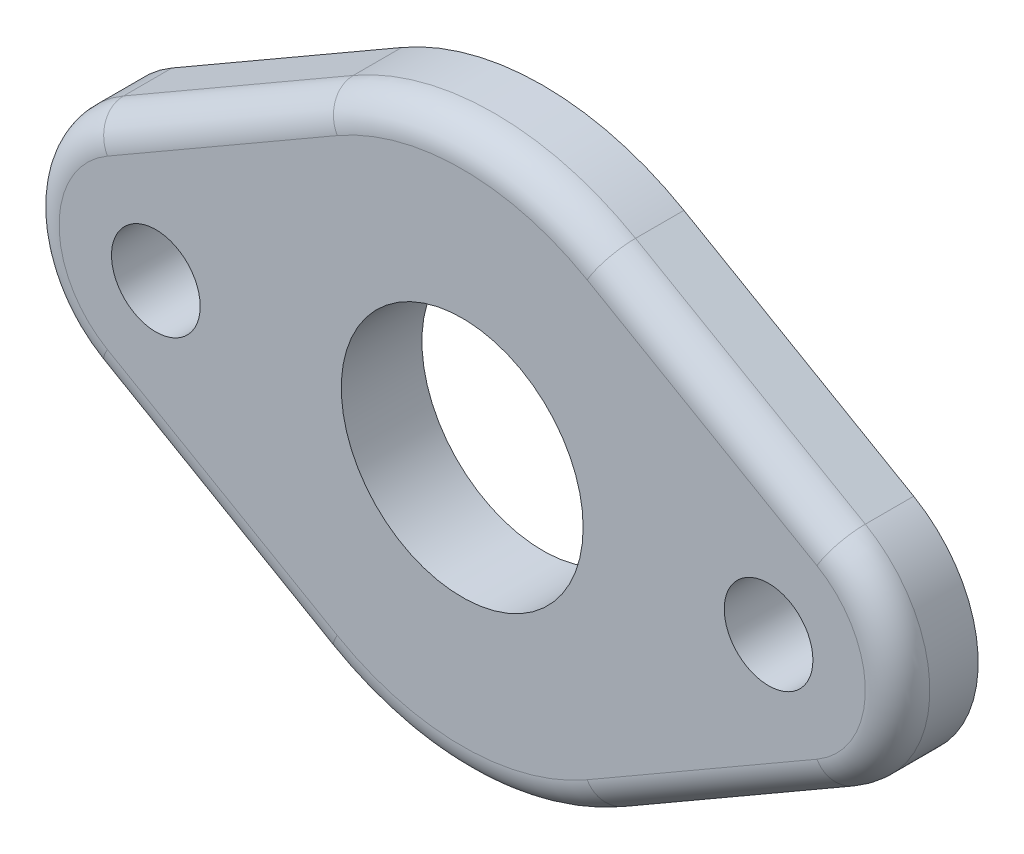
ISO-10303-21;
HEADER;
FILE_DESCRIPTION(('STEP AP214'),'2;1');
FILE_NAME('part.step','',(''),(''),'','','');
FILE_SCHEMA(('AUTOMOTIVE_DESIGN { 1 0 10303 214 1 1 1 1 }'));
ENDSEC;
DATA;
#1=APPLICATION_CONTEXT('core data for automotive mechanical design processes');
#2=APPLICATION_PROTOCOL_DEFINITION('international standard','automotive_design',2000,#1);
#3=PRODUCT_CONTEXT('',#1,'mechanical');
#4=PRODUCT('Part','Part','',(#3));
#5=PRODUCT_RELATED_PRODUCT_CATEGORY('part','',(#4));
#6=PRODUCT_DEFINITION_FORMATION('','',#4);
#7=PRODUCT_DEFINITION_CONTEXT('part definition',#1,'design');
#8=PRODUCT_DEFINITION('design','',#6,#7);
#9=PRODUCT_DEFINITION_SHAPE('','',#8);
#10=(LENGTH_UNIT() NAMED_UNIT(*) SI_UNIT(.MILLI.,.METRE.));
#11=(NAMED_UNIT(*) PLANE_ANGLE_UNIT() SI_UNIT($,.RADIAN.));
#12=(NAMED_UNIT(*) SI_UNIT($,.STERADIAN.) SOLID_ANGLE_UNIT());
#13=UNCERTAINTY_MEASURE_WITH_UNIT(LENGTH_MEASURE(1.E-05),#10,'distance_accuracy_value','');
#14=(GEOMETRIC_REPRESENTATION_CONTEXT(3) GLOBAL_UNCERTAINTY_ASSIGNED_CONTEXT((#13)) GLOBAL_UNIT_ASSIGNED_CONTEXT((#10,
#11,#12)) REPRESENTATION_CONTEXT('',''));
#15=CARTESIAN_POINT('',(0.,0.,0.));
#16=DIRECTION('',(0.,0.,1.));
#17=DIRECTION('',(1.,0.,0.));
#18=AXIS2_PLACEMENT_3D('',#15,#16,#17);
#19=CARTESIAN_POINT('',(0.,85.,5.));
#20=DIRECTION('',(0.,0.,1.));
#21=DIRECTION('',(1.,0.,0.));
#22=AXIS2_PLACEMENT_3D('',#19,#20,#21);
#23=PLANE('',#22);
#24=CARTESIAN_POINT('',(19.,85.,5.));
#25=DIRECTION('',(0.,0.,1.));
#26=DIRECTION('',(1.,0.,0.));
#27=AXIS2_PLACEMENT_3D('',#24,#25,#26);
#28=CIRCLE('',#27,6.00000000000001);
#29=CARTESIAN_POINT('',(22.,79.8038475772934,5.));
#30=VERTEX_POINT('',#29);
#31=CARTESIAN_POINT('',(22.,90.1961524227066,5.));
#32=VERTEX_POINT('',#31);
#33=EDGE_CURVE('E190',#30,#32,#28,.T.);
#34=ORIENTED_EDGE('',*,*,#33,.T.);
#35=DIRECTION('',(-0.866025403784439,0.5,0.));
#36=VECTOR('',#35,1.);
#37=CARTESIAN_POINT('',(7.75,98.4233937586588,5.));
#38=LINE('',#37,#36);
#39=CARTESIAN_POINT('',(7.75,98.4233937586588,5.));
#40=VERTEX_POINT('',#39);
#41=EDGE_CURVE('E192',#32,#40,#38,.T.);
#42=ORIENTED_EDGE('',*,*,#41,.T.);
#43=CARTESIAN_POINT('',(0.,85.,5.));
#44=DIRECTION('',(0.,0.,1.));
#45=DIRECTION('',(1.,0.,0.));
#46=AXIS2_PLACEMENT_3D('',#43,#44,#45);
#47=CIRCLE('',#46,15.5);
#48=CARTESIAN_POINT('',(-7.75,98.4233937586588,5.));
#49=VERTEX_POINT('',#48);
#50=EDGE_CURVE('E128',#40,#49,#47,.T.);
#51=ORIENTED_EDGE('',*,*,#50,.T.);
#52=DIRECTION('',(-0.866025403784439,-0.5,0.));
#53=VECTOR('',#52,1.);
#54=CARTESIAN_POINT('',(-22.,90.1961524227066,5.));
#55=LINE('',#54,#53);
#56=CARTESIAN_POINT('',(-22.,90.1961524227066,5.));
#57=VERTEX_POINT('',#56);
#58=EDGE_CURVE('E180',#49,#57,#55,.T.);
#59=ORIENTED_EDGE('',*,*,#58,.T.);
#60=CARTESIAN_POINT('',(-19.,85.,5.));
#61=DIRECTION('',(0.,0.,1.));
#62=DIRECTION('',(1.,0.,0.));
#63=AXIS2_PLACEMENT_3D('',#60,#61,#62);
#64=CIRCLE('',#63,6.00000000000001);
#65=CARTESIAN_POINT('',(-22.,79.8038475772934,5.));
#66=VERTEX_POINT('',#65);
#67=EDGE_CURVE('E182',#57,#66,#64,.T.);
#68=ORIENTED_EDGE('',*,*,#67,.T.);
#69=DIRECTION('',(0.866025403784439,-0.5,0.));
#70=VECTOR('',#69,1.);
#71=CARTESIAN_POINT('',(-7.75000000000001,71.5766062413412,5.));
#72=LINE('',#71,#70);
#73=CARTESIAN_POINT('',(-7.75000000000001,71.5766062413412,5.));
#74=VERTEX_POINT('',#73);
#75=EDGE_CURVE('E184',#66,#74,#72,.T.);
#76=ORIENTED_EDGE('',*,*,#75,.T.);
#77=CARTESIAN_POINT('',(0.,85.,5.));
#78=DIRECTION('',(0.,0.,1.));
#79=DIRECTION('',(1.,0.,0.));
#80=AXIS2_PLACEMENT_3D('',#77,#78,#79);
#81=CIRCLE('',#80,15.5);
#82=CARTESIAN_POINT('',(7.75000000000001,71.5766062413412,5.));
#83=VERTEX_POINT('',#82);
#84=EDGE_CURVE('E186',#74,#83,#81,.T.);
#85=ORIENTED_EDGE('',*,*,#84,.T.);
#86=DIRECTION('',(0.866025403784439,0.5,0.));
#87=VECTOR('',#86,1.);
#88=CARTESIAN_POINT('',(22.,79.8038475772934,5.));
#89=LINE('',#88,#87);
#90=EDGE_CURVE('E188',#83,#30,#89,.T.);
#91=ORIENTED_EDGE('',*,*,#90,.T.);
#92=EDGE_LOOP('',(#34,#42,#51,#59,#68,#76,#85,#91));
#93=FACE_BOUND('',#92,.T.);
#94=CARTESIAN_POINT('',(0.,85.,5.));
#95=DIRECTION('',(0.,0.,1.));
#96=DIRECTION('',(1.,0.,0.));
#97=AXIS2_PLACEMENT_3D('',#94,#95,#96);
#98=CIRCLE('',#97,7.5);
#99=CARTESIAN_POINT('',(7.5,85.,5.));
#100=VERTEX_POINT('',#99);
#101=EDGE_CURVE('E243',#100,#100,#98,.T.);
#102=ORIENTED_EDGE('',*,*,#101,.F.);
#103=EDGE_LOOP('',(#102));
#104=FACE_BOUND('',#103,.T.);
#105=CARTESIAN_POINT('',(19.,85.,5.));
#106=DIRECTION('',(0.,0.,1.));
#107=DIRECTION('',(1.,0.,0.));
#108=AXIS2_PLACEMENT_3D('',#105,#106,#107);
#109=CIRCLE('',#108,2.75);
#110=CARTESIAN_POINT('',(21.75,85.,5.));
#111=VERTEX_POINT('',#110);
#112=EDGE_CURVE('E145',#111,#111,#109,.T.);
#113=ORIENTED_EDGE('',*,*,#112,.F.);
#114=EDGE_LOOP('',(#113));
#115=FACE_BOUND('',#114,.T.);
#116=CARTESIAN_POINT('',(-19.,85.,5.));
#117=DIRECTION('',(0.,0.,1.));
#118=DIRECTION('',(1.,0.,0.));
#119=AXIS2_PLACEMENT_3D('',#116,#117,#118);
#120=CIRCLE('',#119,2.75);
#121=CARTESIAN_POINT('',(-16.25,85.,5.));
#122=VERTEX_POINT('',#121);
#123=EDGE_CURVE('E235',#122,#122,#120,.T.);
#124=ORIENTED_EDGE('',*,*,#123,.F.);
#125=EDGE_LOOP('',(#124));
#126=FACE_BOUND('',#125,.T.);
#127=ADVANCED_FACE('F32',(#93,#104,#115,#126),#23,.T.);
#128=CARTESIAN_POINT('',(0.,85.,0.));
#129=DIRECTION('',(0.,0.,1.));
#130=DIRECTION('',(1.,0.,0.));
#131=AXIS2_PLACEMENT_3D('',#128,#129,#130);
#132=PLANE('',#131);
#133=CARTESIAN_POINT('',(0.,85.,0.));
#134=DIRECTION('',(0.,0.,1.));
#135=DIRECTION('',(1.,0.,0.));
#136=AXIS2_PLACEMENT_3D('',#133,#134,#135);
#137=CIRCLE('',#136,7.5);
#138=CARTESIAN_POINT('',(7.5,85.,0.));
#139=VERTEX_POINT('',#138);
#140=EDGE_CURVE('E240',#139,#139,#137,.T.);
#141=ORIENTED_EDGE('',*,*,#140,.T.);
#142=EDGE_LOOP('',(#141));
#143=FACE_BOUND('',#142,.T.);
#144=CARTESIAN_POINT('',(0.,85.,0.));
#145=DIRECTION('',(0.,0.,1.));
#146=DIRECTION('',(1.,0.,0.));
#147=AXIS2_PLACEMENT_3D('',#144,#145,#146);
#148=CIRCLE('',#147,17.5);
#149=CARTESIAN_POINT('',(8.75,100.155444566228,0.));
#150=VERTEX_POINT('',#149);
#151=CARTESIAN_POINT('',(-8.75,100.155444566228,0.));
#152=VERTEX_POINT('',#151);
#153=EDGE_CURVE('E136',#150,#152,#148,.T.);
#154=ORIENTED_EDGE('',*,*,#153,.F.);
#155=DIRECTION('',(-0.866025403784439,0.5,0.));
#156=VECTOR('',#155,1.);
#157=CARTESIAN_POINT('',(23.,91.9282032302755,0.));
#158=LINE('',#157,#156);
#159=CARTESIAN_POINT('',(23.,91.9282032302755,0.));
#160=VERTEX_POINT('',#159);
#161=EDGE_CURVE('E165',#160,#150,#158,.T.);
#162=ORIENTED_EDGE('',*,*,#161,.F.);
#163=CARTESIAN_POINT('',(19.,85.,0.));
#164=DIRECTION('',(0.,0.,1.));
#165=DIRECTION('',(1.,0.,0.));
#166=AXIS2_PLACEMENT_3D('',#163,#164,#165);
#167=CIRCLE('',#166,8.00000000000001);
#168=CARTESIAN_POINT('',(23.,78.0717967697245,0.));
#169=VERTEX_POINT('',#168);
#170=EDGE_CURVE('E162',#169,#160,#167,.T.);
#171=ORIENTED_EDGE('',*,*,#170,.F.);
#172=DIRECTION('',(0.866025403784439,0.5,0.));
#173=VECTOR('',#172,1.);
#174=CARTESIAN_POINT('',(8.75000000000001,69.8445554337723,0.));
#175=LINE('',#174,#173);
#176=CARTESIAN_POINT('',(8.75000000000001,69.8445554337723,0.));
#177=VERTEX_POINT('',#176);
#178=EDGE_CURVE('E159',#177,#169,#175,.T.);
#179=ORIENTED_EDGE('',*,*,#178,.F.);
#180=CARTESIAN_POINT('',(0.,85.,0.));
#181=DIRECTION('',(0.,0.,1.));
#182=DIRECTION('',(1.,0.,0.));
#183=AXIS2_PLACEMENT_3D('',#180,#181,#182);
#184=CIRCLE('',#183,17.5);
#185=CARTESIAN_POINT('',(-8.75000000000001,69.8445554337723,0.));
#186=VERTEX_POINT('',#185);
#187=EDGE_CURVE('E156',#186,#177,#184,.T.);
#188=ORIENTED_EDGE('',*,*,#187,.F.);
#189=DIRECTION('',(0.866025403784439,-0.5,0.));
#190=VECTOR('',#189,1.);
#191=CARTESIAN_POINT('',(-23.,78.0717967697245,0.));
#192=LINE('',#191,#190);
#193=CARTESIAN_POINT('',(-23.,78.0717967697245,0.));
#194=VERTEX_POINT('',#193);
#195=EDGE_CURVE('E153',#194,#186,#192,.T.);
#196=ORIENTED_EDGE('',*,*,#195,.F.);
#197=CARTESIAN_POINT('',(-19.,85.,0.));
#198=DIRECTION('',(0.,0.,1.));
#199=DIRECTION('',(1.,0.,0.));
#200=AXIS2_PLACEMENT_3D('',#197,#198,#199);
#201=CIRCLE('',#200,8.00000000000001);
#202=CARTESIAN_POINT('',(-23.,91.9282032302755,0.));
#203=VERTEX_POINT('',#202);
#204=EDGE_CURVE('E139',#203,#194,#201,.T.);
#205=ORIENTED_EDGE('',*,*,#204,.F.);
#206=DIRECTION('',(-0.866025403784439,-0.5,0.));
#207=VECTOR('',#206,1.);
#208=CARTESIAN_POINT('',(-8.75,100.155444566228,0.));
#209=LINE('',#208,#207);
#210=EDGE_CURVE('E123',#152,#203,#209,.T.);
#211=ORIENTED_EDGE('',*,*,#210,.F.);
#212=EDGE_LOOP('',(#154,#162,#171,#179,#188,#196,#205,#211));
#213=FACE_BOUND('',#212,.T.);
#214=CARTESIAN_POINT('',(19.,85.,0.));
#215=DIRECTION('',(0.,0.,1.));
#216=DIRECTION('',(1.,0.,0.));
#217=AXIS2_PLACEMENT_3D('',#214,#215,#216);
#218=CIRCLE('',#217,2.75);
#219=CARTESIAN_POINT('',(21.75,85.,0.));
#220=VERTEX_POINT('',#219);
#221=EDGE_CURVE('E148',#220,#220,#218,.T.);
#222=ORIENTED_EDGE('',*,*,#221,.T.);
#223=EDGE_LOOP('',(#222));
#224=FACE_BOUND('',#223,.T.);
#225=CARTESIAN_POINT('',(-19.,85.,0.));
#226=DIRECTION('',(0.,0.,1.));
#227=DIRECTION('',(1.,0.,0.));
#228=AXIS2_PLACEMENT_3D('',#225,#226,#227);
#229=CIRCLE('',#228,2.75);
#230=CARTESIAN_POINT('',(-16.25,85.,0.));
#231=VERTEX_POINT('',#230);
#232=EDGE_CURVE('E229',#231,#231,#229,.T.);
#233=ORIENTED_EDGE('',*,*,#232,.T.);
#234=EDGE_LOOP('',(#233));
#235=FACE_BOUND('',#234,.T.);
#236=ADVANCED_FACE('F133',(#143,#213,#224,#235),#132,.F.);
#237=CARTESIAN_POINT('',(0.,85.,5.));
#238=DIRECTION('',(0.,0.,-1.));
#239=DIRECTION('',(-1.,0.,0.));
#240=AXIS2_PLACEMENT_3D('',#237,#238,#239);
#241=CYLINDRICAL_SURFACE('',#240,17.5);
#242=DIRECTION('',(0.,0.,-1.));
#243=VECTOR('',#242,1.);
#244=CARTESIAN_POINT('',(-8.75,100.155444566228,5.));
#245=LINE('',#244,#243);
#246=CARTESIAN_POINT('',(-8.75,100.155444566228,3.));
#247=VERTEX_POINT('',#246);
#248=EDGE_CURVE('E120',#247,#152,#245,.T.);
#249=ORIENTED_EDGE('',*,*,#248,.F.);
#250=CARTESIAN_POINT('',(0.,85.,3.));
#251=DIRECTION('',(0.,0.,1.));
#252=DIRECTION('',(1.,0.,0.));
#253=AXIS2_PLACEMENT_3D('',#250,#251,#252);
#254=CIRCLE('',#253,17.5);
#255=CARTESIAN_POINT('',(8.75,100.155444566228,3.));
#256=VERTEX_POINT('',#255);
#257=EDGE_CURVE('E11',#247,#256,#254,.F.);
#258=ORIENTED_EDGE('',*,*,#257,.T.);
#259=DIRECTION('',(0.,0.,-1.));
#260=VECTOR('',#259,1.);
#261=CARTESIAN_POINT('',(8.75,100.155444566228,5.));
#262=LINE('',#261,#260);
#263=EDGE_CURVE('E143',#256,#150,#262,.T.);
#264=ORIENTED_EDGE('',*,*,#263,.T.);
#265=ORIENTED_EDGE('',*,*,#153,.T.);
#266=EDGE_LOOP('',(#249,#258,#264,#265));
#267=FACE_BOUND('',#266,.T.);
#268=ADVANCED_FACE('F141',(#267),#241,.T.);
#269=CARTESIAN_POINT('',(-8.75,100.155444566228,5.));
#270=DIRECTION('',(0.5,-0.866025403784439,0.));
#271=DIRECTION('',(0.866025403784439,0.5,0.));
#272=AXIS2_PLACEMENT_3D('',#269,#270,#271);
#273=PLANE('',#272);
#274=DIRECTION('',(0.,0.,-1.));
#275=VECTOR('',#274,1.);
#276=CARTESIAN_POINT('',(-23.,91.9282032302755,5.));
#277=LINE('',#276,#275);
#278=CARTESIAN_POINT('',(-23.,91.9282032302755,3.));
#279=VERTEX_POINT('',#278);
#280=EDGE_CURVE('E129',#279,#203,#277,.T.);
#281=ORIENTED_EDGE('',*,*,#280,.F.);
#282=DIRECTION('',(-0.866025403784439,-0.5,0.));
#283=VECTOR('',#282,1.);
#284=CARTESIAN_POINT('',(-8.75,100.155444566228,3.));
#285=LINE('',#284,#283);
#286=EDGE_CURVE('E41',#279,#247,#285,.F.);
#287=ORIENTED_EDGE('',*,*,#286,.T.);
#288=ORIENTED_EDGE('',*,*,#248,.T.);
#289=ORIENTED_EDGE('',*,*,#210,.T.);
#290=EDGE_LOOP('',(#281,#287,#288,#289));
#291=FACE_BOUND('',#290,.T.);
#292=ADVANCED_FACE('F122',(#291),#273,.F.);
#293=CARTESIAN_POINT('',(-19.,85.,5.));
#294=DIRECTION('',(0.,0.,-1.));
#295=DIRECTION('',(-1.,0.,0.));
#296=AXIS2_PLACEMENT_3D('',#293,#294,#295);
#297=CYLINDRICAL_SURFACE('',#296,8.00000000000001);
#298=DIRECTION('',(0.,0.,-1.));
#299=VECTOR('',#298,1.);
#300=CARTESIAN_POINT('',(-23.,78.0717967697245,5.));
#301=LINE('',#300,#299);
#302=CARTESIAN_POINT('',(-23.,78.0717967697245,3.));
#303=VERTEX_POINT('',#302);
#304=EDGE_CURVE('E176',#303,#194,#301,.T.);
#305=ORIENTED_EDGE('',*,*,#304,.F.);
#306=CARTESIAN_POINT('',(-19.,85.,3.));
#307=DIRECTION('',(0.,0.,1.));
#308=DIRECTION('',(1.,0.,0.));
#309=AXIS2_PLACEMENT_3D('',#306,#307,#308);
#310=CIRCLE('',#309,8.00000000000001);
#311=EDGE_CURVE('E56',#303,#279,#310,.F.);
#312=ORIENTED_EDGE('',*,*,#311,.T.);
#313=ORIENTED_EDGE('',*,*,#280,.T.);
#314=ORIENTED_EDGE('',*,*,#204,.T.);
#315=EDGE_LOOP('',(#305,#312,#313,#314));
#316=FACE_BOUND('',#315,.T.);
#317=ADVANCED_FACE('F292',(#316),#297,.T.);
#318=CARTESIAN_POINT('',(-23.,78.0717967697245,5.));
#319=DIRECTION('',(0.5,0.866025403784439,0.));
#320=DIRECTION('',(-0.866025403784439,0.5,0.));
#321=AXIS2_PLACEMENT_3D('',#318,#319,#320);
#322=PLANE('',#321);
#323=DIRECTION('',(0.,0.,-1.));
#324=VECTOR('',#323,1.);
#325=CARTESIAN_POINT('',(-8.75000000000001,69.8445554337723,5.));
#326=LINE('',#325,#324);
#327=CARTESIAN_POINT('',(-8.75000000000001,69.8445554337723,3.));
#328=VERTEX_POINT('',#327);
#329=EDGE_CURVE('E174',#328,#186,#326,.T.);
#330=ORIENTED_EDGE('',*,*,#329,.F.);
#331=DIRECTION('',(0.866025403784439,-0.5,0.));
#332=VECTOR('',#331,1.);
#333=CARTESIAN_POINT('',(-23.,78.0717967697245,3.));
#334=LINE('',#333,#332);
#335=EDGE_CURVE('E204',#328,#303,#334,.F.);
#336=ORIENTED_EDGE('',*,*,#335,.T.);
#337=ORIENTED_EDGE('',*,*,#304,.T.);
#338=ORIENTED_EDGE('',*,*,#195,.T.);
#339=EDGE_LOOP('',(#330,#336,#337,#338));
#340=FACE_BOUND('',#339,.T.);
#341=ADVANCED_FACE('F288',(#340),#322,.F.);
#342=CARTESIAN_POINT('',(0.,85.,5.));
#343=DIRECTION('',(0.,0.,-1.));
#344=DIRECTION('',(-1.,0.,0.));
#345=AXIS2_PLACEMENT_3D('',#342,#343,#344);
#346=CYLINDRICAL_SURFACE('',#345,17.5);
#347=DIRECTION('',(0.,0.,-1.));
#348=VECTOR('',#347,1.);
#349=CARTESIAN_POINT('',(8.75000000000001,69.8445554337723,5.));
#350=LINE('',#349,#348);
#351=CARTESIAN_POINT('',(8.75000000000001,69.8445554337723,3.));
#352=VERTEX_POINT('',#351);
#353=EDGE_CURVE('E172',#352,#177,#350,.T.);
#354=ORIENTED_EDGE('',*,*,#353,.F.);
#355=CARTESIAN_POINT('',(0.,85.,3.));
#356=DIRECTION('',(0.,0.,1.));
#357=DIRECTION('',(1.,0.,0.));
#358=AXIS2_PLACEMENT_3D('',#355,#356,#357);
#359=CIRCLE('',#358,17.5);
#360=EDGE_CURVE('E202',#352,#328,#359,.F.);
#361=ORIENTED_EDGE('',*,*,#360,.T.);
#362=ORIENTED_EDGE('',*,*,#329,.T.);
#363=ORIENTED_EDGE('',*,*,#187,.T.);
#364=EDGE_LOOP('',(#354,#361,#362,#363));
#365=FACE_BOUND('',#364,.T.);
#366=ADVANCED_FACE('F284',(#365),#346,.T.);
#367=CARTESIAN_POINT('',(8.75000000000001,69.8445554337723,5.));
#368=DIRECTION('',(-0.5,0.866025403784439,0.));
#369=DIRECTION('',(-0.866025403784439,-0.5,0.));
#370=AXIS2_PLACEMENT_3D('',#367,#368,#369);
#371=PLANE('',#370);
#372=DIRECTION('',(0.,0.,-1.));
#373=VECTOR('',#372,1.);
#374=CARTESIAN_POINT('',(23.,78.0717967697245,5.));
#375=LINE('',#374,#373);
#376=CARTESIAN_POINT('',(23.,78.0717967697245,3.));
#377=VERTEX_POINT('',#376);
#378=EDGE_CURVE('E170',#377,#169,#375,.T.);
#379=ORIENTED_EDGE('',*,*,#378,.F.);
#380=DIRECTION('',(0.866025403784439,0.5,0.));
#381=VECTOR('',#380,1.);
#382=CARTESIAN_POINT('',(8.75,69.8445554337723,3.));
#383=LINE('',#382,#381);
#384=EDGE_CURVE('E200',#377,#352,#383,.F.);
#385=ORIENTED_EDGE('',*,*,#384,.T.);
#386=ORIENTED_EDGE('',*,*,#353,.T.);
#387=ORIENTED_EDGE('',*,*,#178,.T.);
#388=EDGE_LOOP('',(#379,#385,#386,#387));
#389=FACE_BOUND('',#388,.T.);
#390=ADVANCED_FACE('F280',(#389),#371,.F.);
#391=CARTESIAN_POINT('',(19.,85.,5.));
#392=DIRECTION('',(0.,0.,-1.));
#393=DIRECTION('',(-1.,0.,0.));
#394=AXIS2_PLACEMENT_3D('',#391,#392,#393);
#395=CYLINDRICAL_SURFACE('',#394,8.00000000000001);
#396=DIRECTION('',(0.,0.,-1.));
#397=VECTOR('',#396,1.);
#398=CARTESIAN_POINT('',(23.,91.9282032302755,5.));
#399=LINE('',#398,#397);
#400=CARTESIAN_POINT('',(23.,91.9282032302755,3.));
#401=VERTEX_POINT('',#400);
#402=EDGE_CURVE('E168',#401,#160,#399,.T.);
#403=ORIENTED_EDGE('',*,*,#402,.F.);
#404=CARTESIAN_POINT('',(19.,85.,3.));
#405=DIRECTION('',(0.,0.,1.));
#406=DIRECTION('',(1.,0.,0.));
#407=AXIS2_PLACEMENT_3D('',#404,#405,#406);
#408=CIRCLE('',#407,8.00000000000001);
#409=EDGE_CURVE('E198',#401,#377,#408,.F.);
#410=ORIENTED_EDGE('',*,*,#409,.T.);
#411=ORIENTED_EDGE('',*,*,#378,.T.);
#412=ORIENTED_EDGE('',*,*,#170,.T.);
#413=EDGE_LOOP('',(#403,#410,#411,#412));
#414=FACE_BOUND('',#413,.T.);
#415=ADVANCED_FACE('F276',(#414),#395,.T.);
#416=CARTESIAN_POINT('',(23.,91.9282032302755,5.));
#417=DIRECTION('',(-0.5,-0.866025403784439,0.));
#418=DIRECTION('',(0.866025403784439,-0.5,0.));
#419=AXIS2_PLACEMENT_3D('',#416,#417,#418);
#420=PLANE('',#419);
#421=ORIENTED_EDGE('',*,*,#263,.F.);
#422=DIRECTION('',(-0.866025403784439,0.5,0.));
#423=VECTOR('',#422,1.);
#424=CARTESIAN_POINT('',(23.,91.9282032302755,3.));
#425=LINE('',#424,#423);
#426=EDGE_CURVE('E195',#256,#401,#425,.F.);
#427=ORIENTED_EDGE('',*,*,#426,.T.);
#428=ORIENTED_EDGE('',*,*,#402,.T.);
#429=ORIENTED_EDGE('',*,*,#161,.T.);
#430=EDGE_LOOP('',(#421,#427,#428,#429));
#431=FACE_BOUND('',#430,.T.);
#432=ADVANCED_FACE('F262',(#431),#420,.F.);
#433=CARTESIAN_POINT('',(19.,85.,5.));
#434=DIRECTION('',(0.,0.,-1.));
#435=DIRECTION('',(-1.,0.,0.));
#436=AXIS2_PLACEMENT_3D('',#433,#434,#435);
#437=CYLINDRICAL_SURFACE('',#436,2.75);
#438=ORIENTED_EDGE('',*,*,#112,.T.);
#439=EDGE_LOOP('',(#438));
#440=FACE_BOUND('',#439,.T.);
#441=ORIENTED_EDGE('',*,*,#221,.F.);
#442=EDGE_LOOP('',(#441));
#443=FACE_BOUND('',#442,.T.);
#444=ADVANCED_FACE('F253',(#440,#443),#437,.F.);
#445=CARTESIAN_POINT('',(0.,85.,5.));
#446=DIRECTION('',(0.,0.,-1.));
#447=DIRECTION('',(-1.,0.,0.));
#448=AXIS2_PLACEMENT_3D('',#445,#446,#447);
#449=CYLINDRICAL_SURFACE('',#448,7.5);
#450=ORIENTED_EDGE('',*,*,#101,.T.);
#451=EDGE_LOOP('',(#450));
#452=FACE_BOUND('',#451,.T.);
#453=ORIENTED_EDGE('',*,*,#140,.F.);
#454=EDGE_LOOP('',(#453));
#455=FACE_BOUND('',#454,.T.);
#456=ADVANCED_FACE('F250',(#452,#455),#449,.F.);
#457=CARTESIAN_POINT('',(-19.,85.,5.));
#458=DIRECTION('',(0.,0.,-1.));
#459=DIRECTION('',(-1.,0.,0.));
#460=AXIS2_PLACEMENT_3D('',#457,#458,#459);
#461=CYLINDRICAL_SURFACE('',#460,2.75);
#462=ORIENTED_EDGE('',*,*,#123,.T.);
#463=EDGE_LOOP('',(#462));
#464=FACE_BOUND('',#463,.T.);
#465=ORIENTED_EDGE('',*,*,#232,.F.);
#466=EDGE_LOOP('',(#465));
#467=FACE_BOUND('',#466,.T.);
#468=ADVANCED_FACE('F252',(#464,#467),#461,.F.);
#469=CARTESIAN_POINT('',(-7.75000000000001,71.5766062413412,3.));
#470=DIRECTION('',(-0.866025403784439,0.5,0.));
#471=DIRECTION('',(-0.5,-0.866025403784439,0.));
#472=AXIS2_PLACEMENT_3D('',#469,#470,#471);
#473=CYLINDRICAL_SURFACE('',#472,2.);
#474=CARTESIAN_POINT('',(-22.,79.8038475772934,3.));
#475=DIRECTION('',(-0.866025403784438,0.500000000000002,0.));
#476=DIRECTION('',(-0.500000000000002,-0.866025403784438,0.));
#477=AXIS2_PLACEMENT_3D('',#474,#475,#476);
#478=CIRCLE('',#477,2.);
#479=EDGE_CURVE('E223',#303,#66,#478,.T.);
#480=ORIENTED_EDGE('',*,*,#479,.F.);
#481=ORIENTED_EDGE('',*,*,#335,.F.);
#482=CARTESIAN_POINT('',(-7.75000000000001,71.5766062413412,3.));
#483=DIRECTION('',(0.866025403784437,-0.500000000000002,0.));
#484=DIRECTION('',(0.500000000000002,0.866025403784437,0.));
#485=AXIS2_PLACEMENT_3D('',#482,#483,#484);
#486=CIRCLE('',#485,2.);
#487=EDGE_CURVE('E36',#74,#328,#486,.T.);
#488=ORIENTED_EDGE('',*,*,#487,.F.);
#489=ORIENTED_EDGE('',*,*,#75,.F.);
#490=EDGE_LOOP('',(#480,#481,#488,#489));
#491=FACE_BOUND('',#490,.T.);
#492=ADVANCED_FACE('F34',(#491),#473,.T.);
#493=CARTESIAN_POINT('',(0.,85.,3.));
#494=DIRECTION('',(0.,0.,1.));
#495=DIRECTION('',(1.,0.,0.));
#496=AXIS2_PLACEMENT_3D('',#493,#494,#495);
#497=TOROIDAL_SURFACE('',#496,15.5,2.);
#498=ORIENTED_EDGE('',*,*,#487,.T.);
#499=ORIENTED_EDGE('',*,*,#360,.F.);
#500=CARTESIAN_POINT('',(7.75000000000001,71.5766062413412,3.));
#501=DIRECTION('',(0.866025403784438,0.500000000000001,0.));
#502=DIRECTION('',(-0.500000000000001,0.866025403784438,0.));
#503=AXIS2_PLACEMENT_3D('',#500,#501,#502);
#504=CIRCLE('',#503,2.);
#505=EDGE_CURVE('E221',#83,#352,#504,.T.);
#506=ORIENTED_EDGE('',*,*,#505,.F.);
#507=ORIENTED_EDGE('',*,*,#84,.F.);
#508=EDGE_LOOP('',(#498,#499,#506,#507));
#509=FACE_BOUND('',#508,.T.);
#510=ADVANCED_FACE('F322',(#509),#497,.T.);
#511=CARTESIAN_POINT('',(-19.,85.,3.));
#512=DIRECTION('',(0.,0.,1.));
#513=DIRECTION('',(1.,0.,0.));
#514=AXIS2_PLACEMENT_3D('',#511,#512,#513);
#515=TOROIDAL_SURFACE('',#514,6.00000000000001,2.);
#516=ORIENTED_EDGE('',*,*,#479,.T.);
#517=ORIENTED_EDGE('',*,*,#67,.F.);
#518=CARTESIAN_POINT('',(-22.,90.1961524227066,3.));
#519=DIRECTION('',(0.866025403784438,0.500000000000002,0.));
#520=DIRECTION('',(-0.500000000000002,0.866025403784438,0.));
#521=AXIS2_PLACEMENT_3D('',#518,#519,#520);
#522=CIRCLE('',#521,2.);
#523=EDGE_CURVE('E218',#279,#57,#522,.T.);
#524=ORIENTED_EDGE('',*,*,#523,.F.);
#525=ORIENTED_EDGE('',*,*,#311,.F.);
#526=EDGE_LOOP('',(#516,#517,#524,#525));
#527=FACE_BOUND('',#526,.T.);
#528=ADVANCED_FACE('F319',(#527),#515,.T.);
#529=CARTESIAN_POINT('',(7.75000000000001,71.5766062413412,3.));
#530=DIRECTION('',(-0.866025403784439,-0.5,0.));
#531=DIRECTION('',(0.5,-0.866025403784439,0.));
#532=AXIS2_PLACEMENT_3D('',#529,#530,#531);
#533=CYLINDRICAL_SURFACE('',#532,2.);
#534=ORIENTED_EDGE('',*,*,#505,.T.);
#535=ORIENTED_EDGE('',*,*,#384,.F.);
#536=CARTESIAN_POINT('',(22.,79.8038475772934,3.));
#537=DIRECTION('',(0.866025403784438,0.500000000000002,0.));
#538=DIRECTION('',(-0.500000000000002,0.866025403784438,0.));
#539=AXIS2_PLACEMENT_3D('',#536,#537,#538);
#540=CIRCLE('',#539,2.);
#541=EDGE_CURVE('E215',#30,#377,#540,.T.);
#542=ORIENTED_EDGE('',*,*,#541,.F.);
#543=ORIENTED_EDGE('',*,*,#90,.F.);
#544=EDGE_LOOP('',(#534,#535,#542,#543));
#545=FACE_BOUND('',#544,.T.);
#546=ADVANCED_FACE('F315',(#545),#533,.T.);
#547=CARTESIAN_POINT('',(-7.75,98.4233937586588,3.));
#548=DIRECTION('',(0.866025403784439,0.5,0.));
#549=DIRECTION('',(-0.5,0.866025403784439,0.));
#550=AXIS2_PLACEMENT_3D('',#547,#548,#549);
#551=CYLINDRICAL_SURFACE('',#550,2.);
#552=ORIENTED_EDGE('',*,*,#523,.T.);
#553=ORIENTED_EDGE('',*,*,#58,.F.);
#554=CARTESIAN_POINT('',(-7.75,98.4233937586588,3.));
#555=DIRECTION('',(0.866025403784438,0.500000000000001,0.));
#556=DIRECTION('',(-0.500000000000001,0.866025403784438,0.));
#557=AXIS2_PLACEMENT_3D('',#554,#555,#556);
#558=CIRCLE('',#557,2.);
#559=EDGE_CURVE('E212',#247,#49,#558,.T.);
#560=ORIENTED_EDGE('',*,*,#559,.F.);
#561=ORIENTED_EDGE('',*,*,#286,.F.);
#562=EDGE_LOOP('',(#552,#553,#560,#561));
#563=FACE_BOUND('',#562,.T.);
#564=ADVANCED_FACE('F311',(#563),#551,.T.);
#565=CARTESIAN_POINT('',(19.,85.,3.));
#566=DIRECTION('',(0.,0.,1.));
#567=DIRECTION('',(1.,0.,0.));
#568=AXIS2_PLACEMENT_3D('',#565,#566,#567);
#569=TOROIDAL_SURFACE('',#568,6.00000000000001,2.);
#570=ORIENTED_EDGE('',*,*,#541,.T.);
#571=ORIENTED_EDGE('',*,*,#409,.F.);
#572=CARTESIAN_POINT('',(22.,90.1961524227066,3.));
#573=DIRECTION('',(-0.866025403784438,0.500000000000002,0.));
#574=DIRECTION('',(-0.500000000000002,-0.866025403784438,0.));
#575=AXIS2_PLACEMENT_3D('',#572,#573,#574);
#576=CIRCLE('',#575,2.);
#577=EDGE_CURVE('E210',#32,#401,#576,.T.);
#578=ORIENTED_EDGE('',*,*,#577,.F.);
#579=ORIENTED_EDGE('',*,*,#33,.F.);
#580=EDGE_LOOP('',(#570,#571,#578,#579));
#581=FACE_BOUND('',#580,.T.);
#582=ADVANCED_FACE('F307',(#581),#569,.T.);
#583=CARTESIAN_POINT('',(0.,85.,3.));
#584=DIRECTION('',(0.,0.,1.));
#585=DIRECTION('',(1.,0.,0.));
#586=AXIS2_PLACEMENT_3D('',#583,#584,#585);
#587=TOROIDAL_SURFACE('',#586,15.5,2.);
#588=ORIENTED_EDGE('',*,*,#559,.T.);
#589=ORIENTED_EDGE('',*,*,#50,.F.);
#590=CARTESIAN_POINT('',(7.75,98.4233937586588,3.));
#591=DIRECTION('',(0.866025403784438,-0.500000000000001,0.));
#592=DIRECTION('',(0.500000000000001,0.866025403784438,0.));
#593=AXIS2_PLACEMENT_3D('',#590,#591,#592);
#594=CIRCLE('',#593,2.);
#595=EDGE_CURVE('E208',#256,#40,#594,.T.);
#596=ORIENTED_EDGE('',*,*,#595,.F.);
#597=ORIENTED_EDGE('',*,*,#257,.F.);
#598=EDGE_LOOP('',(#588,#589,#596,#597));
#599=FACE_BOUND('',#598,.T.);
#600=ADVANCED_FACE('F303',(#599),#587,.T.);
#601=CARTESIAN_POINT('',(7.75,98.4233937586588,3.));
#602=DIRECTION('',(0.866025403784439,-0.5,0.));
#603=DIRECTION('',(0.5,0.866025403784439,0.));
#604=AXIS2_PLACEMENT_3D('',#601,#602,#603);
#605=CYLINDRICAL_SURFACE('',#604,2.);
#606=ORIENTED_EDGE('',*,*,#577,.T.);
#607=ORIENTED_EDGE('',*,*,#426,.F.);
#608=ORIENTED_EDGE('',*,*,#595,.T.);
#609=ORIENTED_EDGE('',*,*,#41,.F.);
#610=EDGE_LOOP('',(#606,#607,#608,#609));
#611=FACE_BOUND('',#610,.T.);
#612=ADVANCED_FACE('F300',(#611),#605,.T.);
#613=CLOSED_SHELL('',(#127,#236,#268,#292,#317,#341,#366,#390,#415,#432,#444,#456,#468,#492,
#510,#528,#546,#564,#582,#600,#612));
#614=MANIFOLD_SOLID_BREP('B2',#613);
#615=ADVANCED_BREP_SHAPE_REPRESENTATION('',(#18,#614),#14);
#616=SHAPE_DEFINITION_REPRESENTATION(#9,#615);
ENDSEC;
END-ISO-10303-21;
